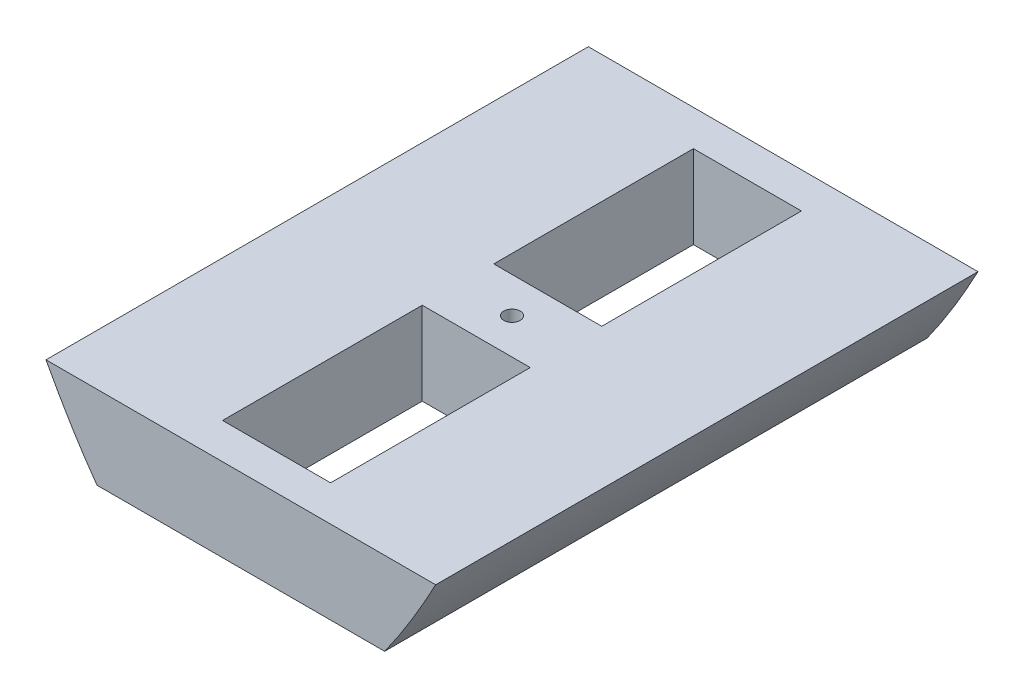
ISO-10303-21;
HEADER;
FILE_DESCRIPTION(('STEP AP214'),'2;1');
FILE_NAME('part.step','',(''),(''),'','','');
FILE_SCHEMA(('AUTOMOTIVE_DESIGN { 1 0 10303 214 1 1 1 1 }'));
ENDSEC;
DATA;
#1=APPLICATION_CONTEXT('core data for automotive mechanical design processes');
#2=APPLICATION_PROTOCOL_DEFINITION('international standard','automotive_design',2000,#1);
#3=PRODUCT_CONTEXT('',#1,'mechanical');
#4=PRODUCT('Part','Part','',(#3));
#5=PRODUCT_RELATED_PRODUCT_CATEGORY('part','',(#4));
#6=PRODUCT_DEFINITION_FORMATION('','',#4);
#7=PRODUCT_DEFINITION_CONTEXT('part definition',#1,'design');
#8=PRODUCT_DEFINITION('design','',#6,#7);
#9=PRODUCT_DEFINITION_SHAPE('','',#8);
#10=(LENGTH_UNIT() NAMED_UNIT(*) SI_UNIT(.MILLI.,.METRE.));
#11=(NAMED_UNIT(*) PLANE_ANGLE_UNIT() SI_UNIT($,.RADIAN.));
#12=(NAMED_UNIT(*) SI_UNIT($,.STERADIAN.) SOLID_ANGLE_UNIT());
#13=UNCERTAINTY_MEASURE_WITH_UNIT(LENGTH_MEASURE(1.E-05),#10,'distance_accuracy_value','');
#14=(GEOMETRIC_REPRESENTATION_CONTEXT(3) GLOBAL_UNCERTAINTY_ASSIGNED_CONTEXT((#13)) GLOBAL_UNIT_ASSIGNED_CONTEXT((#10,
#11,#12)) REPRESENTATION_CONTEXT('',''));
#15=CARTESIAN_POINT('',(0.,0.,0.));
#16=DIRECTION('',(0.,0.,1.));
#17=DIRECTION('',(1.,0.,0.));
#18=AXIS2_PLACEMENT_3D('',#15,#16,#17);
#19=CARTESIAN_POINT('',(-127.000000000214,127.000000000428,331.382));
#20=CARTESIAN_POINT('',(-3.79340656109228E-11,-127.000000000353,331.382));
#21=CARTESIAN_POINT('',(127.000000000138,127.000000000277,331.382));
#22=B_SPLINE_CURVE_WITH_KNOTS('',2,(#19,#20,#21),.UNSPECIFIED.,.F.,.F.,(3,3),
(0.0560283962320779,0.943971603767657),.UNSPECIFIED.);
#23=DIRECTION('',(0.,0.,-1.));
#24=VECTOR('',#23,1.);
#25=SURFACE_OF_LINEAR_EXTRUSION('',#22,#24);
#26=CARTESIAN_POINT('',(-119.051249467909,111.6,331.382));
#27=VERTEX_POINT('',#26);
#28=CARTESIAN_POINT('',(-87.8726351033039,60.8,331.382));
#29=VERTEX_POINT('',#28);
#30=EDGE_CURVE('E11',#27,#29,#22,.T.);
#31=ORIENTED_EDGE('',*,*,#30,.F.);
#32=DIRECTION('',(0.,0.,-1.));
#33=VECTOR('',#32,1.);
#34=CARTESIAN_POINT('',(-119.051249468454,111.6,331.382));
#35=LINE('',#34,#33);
#36=CARTESIAN_POINT('',(-119.051249467909,111.6,0.));
#37=VERTEX_POINT('',#36);
#38=EDGE_CURVE('E121',#27,#37,#35,.T.);
#39=ORIENTED_EDGE('',*,*,#38,.T.);
#40=CARTESIAN_POINT('',(-127.000000000214,127.000000000428,0.));
#41=CARTESIAN_POINT('',(-3.79340656109228E-11,-127.000000000353,0.));
#42=CARTESIAN_POINT('',(127.000000000138,127.000000000277,0.));
#43=B_SPLINE_CURVE_WITH_KNOTS('',2,(#40,#41,#42),.UNSPECIFIED.,.F.,.F.,(3,3),
(0.0560283962320779,0.943971603767657),.UNSPECIFIED.);
#44=CARTESIAN_POINT('',(-87.8726351033039,60.7999999999875,0.));
#45=VERTEX_POINT('',#44);
#46=EDGE_CURVE('E141',#37,#45,#43,.T.);
#47=ORIENTED_EDGE('',*,*,#46,.T.);
#48=DIRECTION('',(0.,0.,-1.));
#49=VECTOR('',#48,1.);
#50=CARTESIAN_POINT('',(-87.872635103313,60.8,331.382));
#51=LINE('',#50,#49);
#52=EDGE_CURVE('E140',#45,#29,#51,.F.);
#53=ORIENTED_EDGE('',*,*,#52,.T.);
#54=EDGE_LOOP('',(#31,#39,#47,#53));
#55=FACE_BOUND('',#54,.T.);
#56=ADVANCED_FACE('F33',(#55),#25,.F.);
#57=CARTESIAN_POINT('',(87.872635103304,60.8,0.));
#58=VERTEX_POINT('',#57);
#59=CARTESIAN_POINT('',(119.051249467909,111.599999998979,0.));
#60=VERTEX_POINT('',#59);
#61=EDGE_CURVE('E167',#58,#60,#43,.T.);
#62=ORIENTED_EDGE('',*,*,#61,.T.);
#63=DIRECTION('',(0.,0.,-1.));
#64=VECTOR('',#63,1.);
#65=CARTESIAN_POINT('',(119.051249468454,111.6,331.382));
#66=LINE('',#65,#64);
#67=CARTESIAN_POINT('',(119.051249467909,111.6,331.382));
#68=VERTEX_POINT('',#67);
#69=EDGE_CURVE('E50',#60,#68,#66,.F.);
#70=ORIENTED_EDGE('',*,*,#69,.T.);
#71=CARTESIAN_POINT('',(87.872635103304,60.8,331.382));
#72=VERTEX_POINT('',#71);
#73=EDGE_CURVE('E43',#72,#68,#22,.T.);
#74=ORIENTED_EDGE('',*,*,#73,.F.);
#75=DIRECTION('',(0.,0.,-1.));
#76=VECTOR('',#75,1.);
#77=CARTESIAN_POINT('',(87.872635103313,60.8,331.382));
#78=LINE('',#77,#76);
#79=EDGE_CURVE('E145',#72,#58,#78,.T.);
#80=ORIENTED_EDGE('',*,*,#79,.T.);
#81=EDGE_LOOP('',(#62,#70,#74,#80));
#82=FACE_BOUND('',#81,.T.);
#83=ADVANCED_FACE('F35',(#82),#25,.F.);
#84=CARTESIAN_POINT('',(-3.79349329726608E-11,0.,331.382));
#85=DIRECTION('',(0.,0.,-1.));
#86=DIRECTION('',(-1.,0.,0.));
#87=AXIS2_PLACEMENT_3D('',#84,#85,#86);
#88=PLANE('',#87);
#89=ORIENTED_EDGE('',*,*,#73,.T.);
#90=DIRECTION('',(1.,0.,0.));
#91=VECTOR('',#90,1.);
#92=CARTESIAN_POINT('',(-130.,111.6,331.382));
#93=LINE('',#92,#91);
#94=EDGE_CURVE('E124',#27,#68,#93,.T.);
#95=ORIENTED_EDGE('',*,*,#94,.F.);
#96=ORIENTED_EDGE('',*,*,#30,.T.);
#97=DIRECTION('',(1.,0.,0.));
#98=VECTOR('',#97,1.);
#99=CARTESIAN_POINT('',(90.,60.8,331.382));
#100=LINE('',#99,#98);
#101=EDGE_CURVE('E190',#29,#72,#100,.T.);
#102=ORIENTED_EDGE('',*,*,#101,.T.);
#103=EDGE_LOOP('',(#89,#95,#96,#102));
#104=FACE_BOUND('',#103,.T.);
#105=ADVANCED_FACE('F133',(#104),#88,.F.);
#106=CARTESIAN_POINT('',(-3.79349329726608E-11,0.,0.));
#107=DIRECTION('',(0.,0.,-1.));
#108=DIRECTION('',(-1.,0.,0.));
#109=AXIS2_PLACEMENT_3D('',#106,#107,#108);
#110=PLANE('',#109);
#111=DIRECTION('',(1.,0.,0.));
#112=VECTOR('',#111,1.);
#113=CARTESIAN_POINT('',(-130.,111.6,0.));
#114=LINE('',#113,#112);
#115=EDGE_CURVE('E125',#37,#60,#114,.T.);
#116=ORIENTED_EDGE('',*,*,#115,.T.);
#117=ORIENTED_EDGE('',*,*,#61,.F.);
#118=DIRECTION('',(1.,0.,0.));
#119=VECTOR('',#118,1.);
#120=CARTESIAN_POINT('',(90.,60.8,0.));
#121=LINE('',#120,#119);
#122=EDGE_CURVE('E129',#45,#58,#121,.T.);
#123=ORIENTED_EDGE('',*,*,#122,.F.);
#124=ORIENTED_EDGE('',*,*,#46,.F.);
#125=EDGE_LOOP('',(#116,#117,#123,#124));
#126=FACE_BOUND('',#125,.T.);
#127=ADVANCED_FACE('F238',(#126),#110,.T.);
#128=CARTESIAN_POINT('',(-33.,-3.79141162909491E-11,21.8455));
#129=DIRECTION('',(-1.,0.,0.));
#130=DIRECTION('',(0.,0.,1.));
#131=AXIS2_PLACEMENT_3D('',#128,#129,#130);
#132=PLANE('',#131);
#133=DIRECTION('',(0.,1.,0.));
#134=VECTOR('',#133,1.);
#135=CARTESIAN_POINT('',(-33.,-3.79141162909491E-11,21.8455));
#136=LINE('',#135,#134);
#137=CARTESIAN_POINT('',(-33.,60.8,21.8455));
#138=VERTEX_POINT('',#137);
#139=CARTESIAN_POINT('',(-33.,111.6,21.8455));
#140=VERTEX_POINT('',#139);
#141=EDGE_CURVE('E164',#138,#140,#136,.T.);
#142=ORIENTED_EDGE('',*,*,#141,.T.);
#143=DIRECTION('',(0.,0.,1.));
#144=VECTOR('',#143,1.);
#145=CARTESIAN_POINT('',(-33.,111.6,21.8455));
#146=LINE('',#145,#144);
#147=CARTESIAN_POINT('',(-33.,111.6,143.8455));
#148=VERTEX_POINT('',#147);
#149=EDGE_CURVE('E228',#140,#148,#146,.T.);
#150=ORIENTED_EDGE('',*,*,#149,.T.);
#151=DIRECTION('',(0.,1.,0.));
#152=VECTOR('',#151,1.);
#153=CARTESIAN_POINT('',(-33.,-3.79141162909491E-11,143.8455));
#154=LINE('',#153,#152);
#155=CARTESIAN_POINT('',(-33.,60.8,143.8455));
#156=VERTEX_POINT('',#155);
#157=EDGE_CURVE('E158',#156,#148,#154,.T.);
#158=ORIENTED_EDGE('',*,*,#157,.F.);
#159=DIRECTION('',(0.,0.,-1.));
#160=VECTOR('',#159,1.);
#161=CARTESIAN_POINT('',(-33.,60.8,21.8455));
#162=LINE('',#161,#160);
#163=EDGE_CURVE('E151',#156,#138,#162,.T.);
#164=ORIENTED_EDGE('',*,*,#163,.T.);
#165=EDGE_LOOP('',(#142,#150,#158,#164));
#166=FACE_BOUND('',#165,.T.);
#167=ADVANCED_FACE('F220',(#166),#132,.F.);
#168=CARTESIAN_POINT('',(-33.,-3.79141162909491E-11,21.8455));
#169=DIRECTION('',(0.,0.,-1.));
#170=DIRECTION('',(-1.,0.,0.));
#171=AXIS2_PLACEMENT_3D('',#168,#169,#170);
#172=PLANE('',#171);
#173=DIRECTION('',(0.,1.,0.));
#174=VECTOR('',#173,1.);
#175=CARTESIAN_POINT('',(33.,-3.79141162909491E-11,21.8455));
#176=LINE('',#175,#174);
#177=CARTESIAN_POINT('',(33.,60.8,21.8455));
#178=VERTEX_POINT('',#177);
#179=CARTESIAN_POINT('',(33.,111.6,21.8455));
#180=VERTEX_POINT('',#179);
#181=EDGE_CURVE('E168',#178,#180,#176,.T.);
#182=ORIENTED_EDGE('',*,*,#181,.T.);
#183=DIRECTION('',(-1.,0.,0.));
#184=VECTOR('',#183,1.);
#185=CARTESIAN_POINT('',(-33.,111.6,21.8455));
#186=LINE('',#185,#184);
#187=EDGE_CURVE('E227',#180,#140,#186,.T.);
#188=ORIENTED_EDGE('',*,*,#187,.T.);
#189=ORIENTED_EDGE('',*,*,#141,.F.);
#190=DIRECTION('',(1.,0.,0.));
#191=VECTOR('',#190,1.);
#192=CARTESIAN_POINT('',(-33.,60.8,21.8455));
#193=LINE('',#192,#191);
#194=EDGE_CURVE('E214',#138,#178,#193,.T.);
#195=ORIENTED_EDGE('',*,*,#194,.T.);
#196=EDGE_LOOP('',(#182,#188,#189,#195));
#197=FACE_BOUND('',#196,.T.);
#198=ADVANCED_FACE('F225',(#197),#172,.F.);
#199=CARTESIAN_POINT('',(33.,-3.79141162909491E-11,21.8455));
#200=DIRECTION('',(1.,0.,0.));
#201=DIRECTION('',(0.,0.,-1.));
#202=AXIS2_PLACEMENT_3D('',#199,#200,#201);
#203=PLANE('',#202);
#204=DIRECTION('',(0.,1.,0.));
#205=VECTOR('',#204,1.);
#206=CARTESIAN_POINT('',(33.,-3.79141162909491E-11,143.8455));
#207=LINE('',#206,#205);
#208=CARTESIAN_POINT('',(33.0000000000001,60.8,143.8455));
#209=VERTEX_POINT('',#208);
#210=CARTESIAN_POINT('',(33.,111.6,143.8455));
#211=VERTEX_POINT('',#210);
#212=EDGE_CURVE('E171',#209,#211,#207,.T.);
#213=ORIENTED_EDGE('',*,*,#212,.T.);
#214=DIRECTION('',(0.,0.,-1.));
#215=VECTOR('',#214,1.);
#216=CARTESIAN_POINT('',(33.,111.6,21.8455));
#217=LINE('',#216,#215);
#218=EDGE_CURVE('E58',#211,#180,#217,.T.);
#219=ORIENTED_EDGE('',*,*,#218,.T.);
#220=ORIENTED_EDGE('',*,*,#181,.F.);
#221=DIRECTION('',(0.,0.,1.));
#222=VECTOR('',#221,1.);
#223=CARTESIAN_POINT('',(33.,60.8,21.8455));
#224=LINE('',#223,#222);
#225=EDGE_CURVE('E211',#178,#209,#224,.T.);
#226=ORIENTED_EDGE('',*,*,#225,.T.);
#227=EDGE_LOOP('',(#213,#219,#220,#226));
#228=FACE_BOUND('',#227,.T.);
#229=ADVANCED_FACE('F257',(#228),#203,.F.);
#230=CARTESIAN_POINT('',(-33.,-3.79141162909491E-11,143.8455));
#231=DIRECTION('',(0.,0.,1.));
#232=DIRECTION('',(1.,0.,0.));
#233=AXIS2_PLACEMENT_3D('',#230,#231,#232);
#234=PLANE('',#233);
#235=ORIENTED_EDGE('',*,*,#157,.T.);
#236=DIRECTION('',(1.,0.,0.));
#237=VECTOR('',#236,1.);
#238=CARTESIAN_POINT('',(-33.,111.6,143.8455));
#239=LINE('',#238,#237);
#240=EDGE_CURVE('E231',#148,#211,#239,.T.);
#241=ORIENTED_EDGE('',*,*,#240,.T.);
#242=ORIENTED_EDGE('',*,*,#212,.F.);
#243=DIRECTION('',(-1.,0.,0.));
#244=VECTOR('',#243,1.);
#245=CARTESIAN_POINT('',(-33.,60.8,143.8455));
#246=LINE('',#245,#244);
#247=EDGE_CURVE('E208',#209,#156,#246,.T.);
#248=ORIENTED_EDGE('',*,*,#247,.T.);
#249=EDGE_LOOP('',(#235,#241,#242,#248));
#250=FACE_BOUND('',#249,.T.);
#251=ADVANCED_FACE('F255',(#250),#234,.F.);
#252=CARTESIAN_POINT('',(-33.,-3.79141162909491E-11,187.5365));
#253=DIRECTION('',(-1.,0.,0.));
#254=DIRECTION('',(0.,0.,1.));
#255=AXIS2_PLACEMENT_3D('',#252,#253,#254);
#256=PLANE('',#255);
#257=DIRECTION('',(0.,1.,0.));
#258=VECTOR('',#257,1.);
#259=CARTESIAN_POINT('',(-33.,-3.79141162909491E-11,187.5365));
#260=LINE('',#259,#258);
#261=CARTESIAN_POINT('',(-33.,60.8,187.5365));
#262=VERTEX_POINT('',#261);
#263=CARTESIAN_POINT('',(-33.,111.6,187.5365));
#264=VERTEX_POINT('',#263);
#265=EDGE_CURVE('E155',#262,#264,#260,.T.);
#266=ORIENTED_EDGE('',*,*,#265,.T.);
#267=DIRECTION('',(0.,0.,1.));
#268=VECTOR('',#267,1.);
#269=CARTESIAN_POINT('',(-33.,111.6,187.5365));
#270=LINE('',#269,#268);
#271=CARTESIAN_POINT('',(-33.,111.6,309.5365));
#272=VERTEX_POINT('',#271);
#273=EDGE_CURVE('E251',#264,#272,#270,.T.);
#274=ORIENTED_EDGE('',*,*,#273,.T.);
#275=DIRECTION('',(0.,1.,0.));
#276=VECTOR('',#275,1.);
#277=CARTESIAN_POINT('',(-33.,-3.79141162909491E-11,309.5365));
#278=LINE('',#277,#276);
#279=CARTESIAN_POINT('',(-33.,60.8,309.5365));
#280=VERTEX_POINT('',#279);
#281=EDGE_CURVE('E144',#280,#272,#278,.T.);
#282=ORIENTED_EDGE('',*,*,#281,.F.);
#283=DIRECTION('',(0.,0.,-1.));
#284=VECTOR('',#283,1.);
#285=CARTESIAN_POINT('',(-33.,60.8,187.5365));
#286=LINE('',#285,#284);
#287=EDGE_CURVE('E205',#280,#262,#286,.T.);
#288=ORIENTED_EDGE('',*,*,#287,.T.);
#289=EDGE_LOOP('',(#266,#274,#282,#288));
#290=FACE_BOUND('',#289,.T.);
#291=ADVANCED_FACE('F289',(#290),#256,.F.);
#292=CARTESIAN_POINT('',(-33.,-3.79141162909491E-11,187.5365));
#293=DIRECTION('',(0.,0.,-1.));
#294=DIRECTION('',(-1.,0.,0.));
#295=AXIS2_PLACEMENT_3D('',#292,#293,#294);
#296=PLANE('',#295);
#297=DIRECTION('',(0.,1.,0.));
#298=VECTOR('',#297,1.);
#299=CARTESIAN_POINT('',(33.,-3.79141162909491E-11,187.5365));
#300=LINE('',#299,#298);
#301=CARTESIAN_POINT('',(33.,60.8,187.5365));
#302=VERTEX_POINT('',#301);
#303=CARTESIAN_POINT('',(33.,111.6,187.5365));
#304=VERTEX_POINT('',#303);
#305=EDGE_CURVE('E159',#302,#304,#300,.T.);
#306=ORIENTED_EDGE('',*,*,#305,.T.);
#307=DIRECTION('',(-1.,0.,0.));
#308=VECTOR('',#307,1.);
#309=CARTESIAN_POINT('',(-33.,111.6,187.5365));
#310=LINE('',#309,#308);
#311=EDGE_CURVE('E248',#304,#264,#310,.T.);
#312=ORIENTED_EDGE('',*,*,#311,.T.);
#313=ORIENTED_EDGE('',*,*,#265,.F.);
#314=DIRECTION('',(1.,0.,0.));
#315=VECTOR('',#314,1.);
#316=CARTESIAN_POINT('',(-33.,60.8,187.5365));
#317=LINE('',#316,#315);
#318=EDGE_CURVE('E202',#262,#302,#317,.T.);
#319=ORIENTED_EDGE('',*,*,#318,.T.);
#320=EDGE_LOOP('',(#306,#312,#313,#319));
#321=FACE_BOUND('',#320,.T.);
#322=ADVANCED_FACE('F296',(#321),#296,.F.);
#323=CARTESIAN_POINT('',(33.,-3.79141162909491E-11,187.5365));
#324=DIRECTION('',(1.,0.,0.));
#325=DIRECTION('',(0.,0.,-1.));
#326=AXIS2_PLACEMENT_3D('',#323,#324,#325);
#327=PLANE('',#326);
#328=DIRECTION('',(0.,1.,0.));
#329=VECTOR('',#328,1.);
#330=CARTESIAN_POINT('',(33.,-3.79141162909491E-11,309.5365));
#331=LINE('',#330,#329);
#332=CARTESIAN_POINT('',(33.0000000000001,60.8,309.5365));
#333=VERTEX_POINT('',#332);
#334=CARTESIAN_POINT('',(33.,111.6,309.5365));
#335=VERTEX_POINT('',#334);
#336=EDGE_CURVE('E148',#333,#335,#331,.T.);
#337=ORIENTED_EDGE('',*,*,#336,.T.);
#338=DIRECTION('',(0.,0.,-1.));
#339=VECTOR('',#338,1.);
#340=CARTESIAN_POINT('',(33.,111.6,187.5365));
#341=LINE('',#340,#339);
#342=EDGE_CURVE('E245',#335,#304,#341,.T.);
#343=ORIENTED_EDGE('',*,*,#342,.T.);
#344=ORIENTED_EDGE('',*,*,#305,.F.);
#345=DIRECTION('',(0.,0.,1.));
#346=VECTOR('',#345,1.);
#347=CARTESIAN_POINT('',(33.,60.8,187.5365));
#348=LINE('',#347,#346);
#349=EDGE_CURVE('E194',#302,#333,#348,.T.);
#350=ORIENTED_EDGE('',*,*,#349,.T.);
#351=EDGE_LOOP('',(#337,#343,#344,#350));
#352=FACE_BOUND('',#351,.T.);
#353=ADVANCED_FACE('F300',(#352),#327,.F.);
#354=CARTESIAN_POINT('',(-33.,-3.79141162909491E-11,309.5365));
#355=DIRECTION('',(0.,0.,1.));
#356=DIRECTION('',(1.,0.,0.));
#357=AXIS2_PLACEMENT_3D('',#354,#355,#356);
#358=PLANE('',#357);
#359=ORIENTED_EDGE('',*,*,#281,.T.);
#360=DIRECTION('',(1.,0.,0.));
#361=VECTOR('',#360,1.);
#362=CARTESIAN_POINT('',(-33.,111.6,309.5365));
#363=LINE('',#362,#361);
#364=EDGE_CURVE('E241',#272,#335,#363,.T.);
#365=ORIENTED_EDGE('',*,*,#364,.T.);
#366=ORIENTED_EDGE('',*,*,#336,.F.);
#367=DIRECTION('',(-1.,0.,0.));
#368=VECTOR('',#367,1.);
#369=CARTESIAN_POINT('',(-33.,60.8,309.5365));
#370=LINE('',#369,#368);
#371=EDGE_CURVE('E189',#333,#280,#370,.T.);
#372=ORIENTED_EDGE('',*,*,#371,.T.);
#373=EDGE_LOOP('',(#359,#365,#366,#372));
#374=FACE_BOUND('',#373,.T.);
#375=ADVANCED_FACE('F269',(#374),#358,.F.);
#376=CARTESIAN_POINT('',(-3.86635168325711E-11,-3.79141162909491E-11,165.691));
#377=DIRECTION('',(0.,1.,0.));
#378=DIRECTION('',(0.,0.,1.));
#379=AXIS2_PLACEMENT_3D('',#376,#377,#378);
#380=CYLINDRICAL_SURFACE('',#379,5.);
#381=CARTESIAN_POINT('',(-3.86635168325711E-11,111.6,165.691));
#382=DIRECTION('',(0.,-1.,0.));
#383=DIRECTION('',(0.,0.,-1.));
#384=AXIS2_PLACEMENT_3D('',#381,#382,#383);
#385=CIRCLE('',#384,5.);
#386=CARTESIAN_POINT('',(-3.86635168325711E-11,111.6,160.691));
#387=VERTEX_POINT('',#386);
#388=EDGE_CURVE('E38',#387,#387,#385,.F.);
#389=ORIENTED_EDGE('',*,*,#388,.T.);
#390=EDGE_LOOP('',(#389));
#391=FACE_BOUND('',#390,.T.);
#392=CARTESIAN_POINT('',(-3.86635168325711E-11,60.8,165.691));
#393=DIRECTION('',(0.,1.,0.));
#394=DIRECTION('',(0.,0.,1.));
#395=AXIS2_PLACEMENT_3D('',#392,#393,#394);
#396=CIRCLE('',#395,5.);
#397=CARTESIAN_POINT('',(-3.86635168325711E-11,60.8,170.691));
#398=VERTEX_POINT('',#397);
#399=EDGE_CURVE('E184',#398,#398,#396,.F.);
#400=ORIENTED_EDGE('',*,*,#399,.T.);
#401=EDGE_LOOP('',(#400));
#402=FACE_BOUND('',#401,.T.);
#403=ADVANCED_FACE('F260',(#391,#402),#380,.F.);
#404=CARTESIAN_POINT('',(90.,60.8,331.382));
#405=DIRECTION('',(0.,1.,0.));
#406=DIRECTION('',(0.,0.,1.));
#407=AXIS2_PLACEMENT_3D('',#404,#405,#406);
#408=PLANE('',#407);
#409=ORIENTED_EDGE('',*,*,#399,.F.);
#410=EDGE_LOOP('',(#409));
#411=FACE_BOUND('',#410,.T.);
#412=ORIENTED_EDGE('',*,*,#371,.F.);
#413=ORIENTED_EDGE('',*,*,#349,.F.);
#414=ORIENTED_EDGE('',*,*,#318,.F.);
#415=ORIENTED_EDGE('',*,*,#287,.F.);
#416=EDGE_LOOP('',(#412,#413,#414,#415));
#417=FACE_BOUND('',#416,.T.);
#418=ORIENTED_EDGE('',*,*,#247,.F.);
#419=ORIENTED_EDGE('',*,*,#225,.F.);
#420=ORIENTED_EDGE('',*,*,#194,.F.);
#421=ORIENTED_EDGE('',*,*,#163,.F.);
#422=EDGE_LOOP('',(#418,#419,#420,#421));
#423=FACE_BOUND('',#422,.T.);
#424=ORIENTED_EDGE('',*,*,#122,.T.);
#425=ORIENTED_EDGE('',*,*,#79,.F.);
#426=ORIENTED_EDGE('',*,*,#101,.F.);
#427=ORIENTED_EDGE('',*,*,#52,.F.);
#428=EDGE_LOOP('',(#424,#425,#426,#427));
#429=FACE_BOUND('',#428,.T.);
#430=ADVANCED_FACE('F258',(#411,#417,#423,#429),#408,.F.);
#431=CARTESIAN_POINT('',(-130.,111.6,0.));
#432=DIRECTION('',(0.,-1.,0.));
#433=DIRECTION('',(0.,0.,-1.));
#434=AXIS2_PLACEMENT_3D('',#431,#432,#433);
#435=PLANE('',#434);
#436=ORIENTED_EDGE('',*,*,#388,.F.);
#437=EDGE_LOOP('',(#436));
#438=FACE_BOUND('',#437,.T.);
#439=ORIENTED_EDGE('',*,*,#311,.F.);
#440=ORIENTED_EDGE('',*,*,#342,.F.);
#441=ORIENTED_EDGE('',*,*,#364,.F.);
#442=ORIENTED_EDGE('',*,*,#273,.F.);
#443=EDGE_LOOP('',(#439,#440,#441,#442));
#444=FACE_BOUND('',#443,.T.);
#445=ORIENTED_EDGE('',*,*,#187,.F.);
#446=ORIENTED_EDGE('',*,*,#218,.F.);
#447=ORIENTED_EDGE('',*,*,#240,.F.);
#448=ORIENTED_EDGE('',*,*,#149,.F.);
#449=EDGE_LOOP('',(#445,#446,#447,#448));
#450=FACE_BOUND('',#449,.T.);
#451=ORIENTED_EDGE('',*,*,#94,.T.);
#452=ORIENTED_EDGE('',*,*,#69,.F.);
#453=ORIENTED_EDGE('',*,*,#115,.F.);
#454=ORIENTED_EDGE('',*,*,#38,.F.);
#455=EDGE_LOOP('',(#451,#452,#453,#454));
#456=FACE_BOUND('',#455,.T.);
#457=ADVANCED_FACE('F123',(#438,#444,#450,#456),#435,.F.);
#458=CLOSED_SHELL('',(#56,#83,#105,#127,#167,#198,#229,#251,#291,#322,#353,#375,#403,#430,#457));
#459=MANIFOLD_SOLID_BREP('B2',#458);
#460=ADVANCED_BREP_SHAPE_REPRESENTATION('',(#18,#459),#14);
#461=SHAPE_DEFINITION_REPRESENTATION(#9,#460);
ENDSEC;
END-ISO-10303-21;
